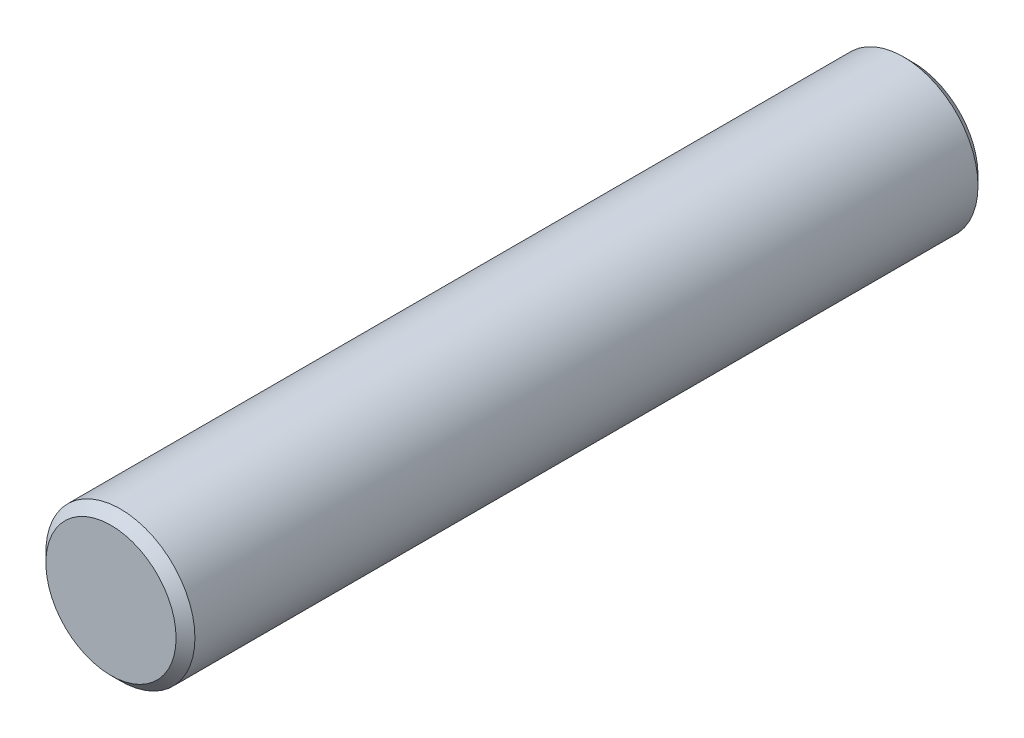
ISO-10303-21;
HEADER;
FILE_DESCRIPTION(('STEP AP214'),'2;1');
FILE_NAME('part.step','',(''),(''),'','','');
FILE_SCHEMA(('AUTOMOTIVE_DESIGN { 1 0 10303 214 1 1 1 1 }'));
ENDSEC;
DATA;
#1=APPLICATION_CONTEXT('core data for automotive mechanical design processes');
#2=APPLICATION_PROTOCOL_DEFINITION('international standard','automotive_design',2000,#1);
#3=PRODUCT_CONTEXT('',#1,'mechanical');
#4=PRODUCT('Part','Part','',(#3));
#5=PRODUCT_RELATED_PRODUCT_CATEGORY('part','',(#4));
#6=PRODUCT_DEFINITION_FORMATION('','',#4);
#7=PRODUCT_DEFINITION_CONTEXT('part definition',#1,'design');
#8=PRODUCT_DEFINITION('design','',#6,#7);
#9=PRODUCT_DEFINITION_SHAPE('','',#8);
#10=(LENGTH_UNIT() NAMED_UNIT(*) SI_UNIT(.MILLI.,.METRE.));
#11=(NAMED_UNIT(*) PLANE_ANGLE_UNIT() SI_UNIT($,.RADIAN.));
#12=(NAMED_UNIT(*) SI_UNIT($,.STERADIAN.) SOLID_ANGLE_UNIT());
#13=UNCERTAINTY_MEASURE_WITH_UNIT(LENGTH_MEASURE(1.E-05),#10,'distance_accuracy_value','');
#14=(GEOMETRIC_REPRESENTATION_CONTEXT(3) GLOBAL_UNCERTAINTY_ASSIGNED_CONTEXT((#13)) GLOBAL_UNIT_ASSIGNED_CONTEXT((#10,
#11,#12)) REPRESENTATION_CONTEXT('',''));
#15=CARTESIAN_POINT('',(0.,0.,0.));
#16=DIRECTION('',(0.,0.,1.));
#17=DIRECTION('',(1.,0.,0.));
#18=AXIS2_PLACEMENT_3D('',#15,#16,#17);
#19=CARTESIAN_POINT('',(0.,0.,8.5));
#20=DIRECTION('',(0.,0.,-1.));
#21=DIRECTION('',(-1.,0.,0.));
#22=AXIS2_PLACEMENT_3D('',#19,#20,#21);
#23=CYLINDRICAL_SURFACE('',#22,0.79);
#24=CARTESIAN_POINT('',(0.,0.,8.4));
#25=DIRECTION('',(0.,0.,1.));
#26=DIRECTION('',(1.,0.,0.));
#27=AXIS2_PLACEMENT_3D('',#24,#25,#26);
#28=CIRCLE('',#27,0.79);
#29=CARTESIAN_POINT('',(0.79,0.,8.4));
#30=VERTEX_POINT('',#29);
#31=EDGE_CURVE('E42',#30,#30,#28,.F.);
#32=ORIENTED_EDGE('',*,*,#31,.T.);
#33=EDGE_LOOP('',(#32));
#34=FACE_BOUND('',#33,.T.);
#35=CARTESIAN_POINT('',(0.,0.,0.100000000000001));
#36=DIRECTION('',(0.,0.,1.));
#37=DIRECTION('',(1.,0.,0.));
#38=AXIS2_PLACEMENT_3D('',#35,#36,#37);
#39=CIRCLE('',#38,0.79);
#40=CARTESIAN_POINT('',(0.79,0.,0.100000000000001));
#41=VERTEX_POINT('',#40);
#42=EDGE_CURVE('E46',#41,#41,#39,.T.);
#43=ORIENTED_EDGE('',*,*,#42,.T.);
#44=EDGE_LOOP('',(#43));
#45=FACE_BOUND('',#44,.T.);
#46=ADVANCED_FACE('F35',(#34,#45),#23,.T.);
#47=CARTESIAN_POINT('',(0.,0.,8.5));
#48=DIRECTION('',(0.,0.,1.));
#49=DIRECTION('',(1.,0.,0.));
#50=AXIS2_PLACEMENT_3D('',#47,#48,#49);
#51=PLANE('',#50);
#52=CARTESIAN_POINT('',(0.,0.,8.5));
#53=DIRECTION('',(0.,0.,1.));
#54=DIRECTION('',(1.,0.,0.));
#55=AXIS2_PLACEMENT_3D('',#52,#53,#54);
#56=CIRCLE('',#55,0.689999999999999);
#57=CARTESIAN_POINT('',(0.689999999999999,0.,8.5));
#58=VERTEX_POINT('',#57);
#59=EDGE_CURVE('E50',#58,#58,#56,.T.);
#60=ORIENTED_EDGE('',*,*,#59,.T.);
#61=EDGE_LOOP('',(#60));
#62=FACE_BOUND('',#61,.T.);
#63=ADVANCED_FACE('F56',(#62),#51,.T.);
#64=CARTESIAN_POINT('',(0.,0.,0.));
#65=DIRECTION('',(0.,0.,1.));
#66=DIRECTION('',(1.,0.,0.));
#67=AXIS2_PLACEMENT_3D('',#64,#65,#66);
#68=PLANE('',#67);
#69=CARTESIAN_POINT('',(0.,0.,0.));
#70=DIRECTION('',(0.,0.,1.));
#71=DIRECTION('',(1.,0.,0.));
#72=AXIS2_PLACEMENT_3D('',#69,#70,#71);
#73=CIRCLE('',#72,0.689999999999999);
#74=CARTESIAN_POINT('',(0.689999999999999,0.,0.));
#75=VERTEX_POINT('',#74);
#76=EDGE_CURVE('E10',#75,#75,#73,.F.);
#77=ORIENTED_EDGE('',*,*,#76,.T.);
#78=EDGE_LOOP('',(#77));
#79=FACE_BOUND('',#78,.T.);
#80=ADVANCED_FACE('F60',(#79),#68,.F.);
#81=CARTESIAN_POINT('',(0.,0.,8.5));
#82=DIRECTION('',(0.,0.,-1.));
#83=DIRECTION('',(-1.,0.,0.));
#84=AXIS2_PLACEMENT_3D('',#81,#82,#83);
#85=CONICAL_SURFACE('',#84,0.689999999999999,0.785398163397446);
#86=ORIENTED_EDGE('',*,*,#31,.F.);
#87=EDGE_LOOP('',(#86));
#88=FACE_BOUND('',#87,.T.);
#89=ORIENTED_EDGE('',*,*,#59,.F.);
#90=EDGE_LOOP('',(#89));
#91=FACE_BOUND('',#90,.T.);
#92=ADVANCED_FACE('F58',(#88,#91),#85,.T.);
#93=CARTESIAN_POINT('',(0.,0.,0.100000000000001));
#94=DIRECTION('',(0.,0.,1.));
#95=DIRECTION('',(1.,0.,0.));
#96=AXIS2_PLACEMENT_3D('',#93,#94,#95);
#97=CONICAL_SURFACE('',#96,0.79,0.785398163397446);
#98=ORIENTED_EDGE('',*,*,#76,.F.);
#99=EDGE_LOOP('',(#98));
#100=FACE_BOUND('',#99,.T.);
#101=ORIENTED_EDGE('',*,*,#42,.F.);
#102=EDGE_LOOP('',(#101));
#103=FACE_BOUND('',#102,.T.);
#104=ADVANCED_FACE('F37',(#100,#103),#97,.T.);
#105=CLOSED_SHELL('',(#46,#63,#80,#92,#104));
#106=MANIFOLD_SOLID_BREP('B2',#105);
#107=ADVANCED_BREP_SHAPE_REPRESENTATION('',(#18,#106),#14);
#108=SHAPE_DEFINITION_REPRESENTATION(#9,#107);
ENDSEC;
END-ISO-10303-21;
